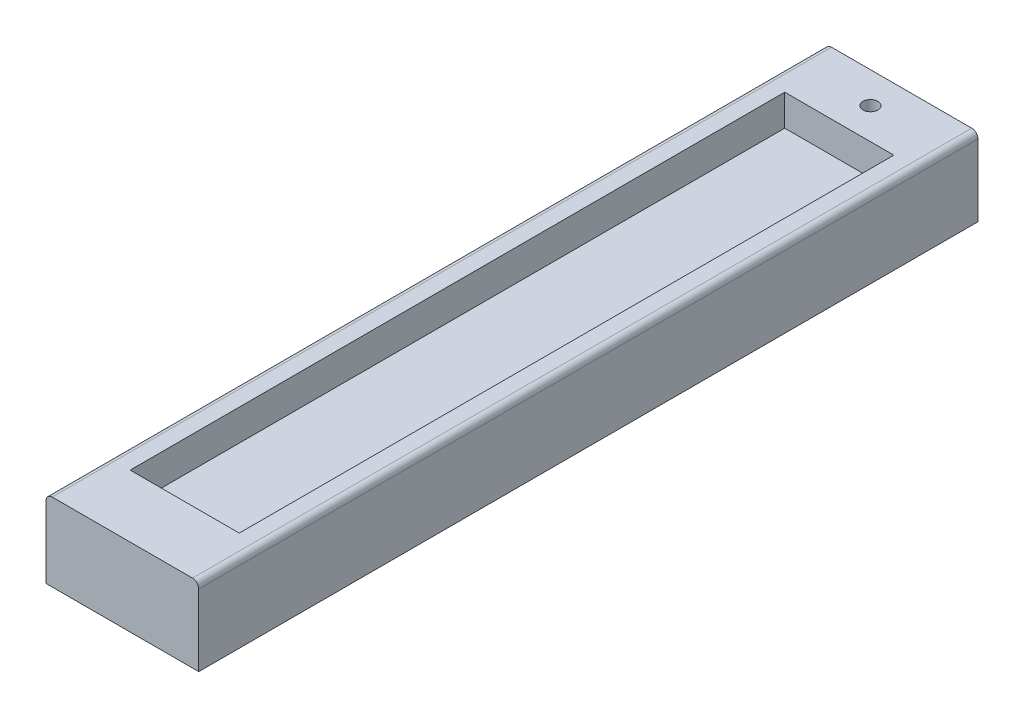
ISO-10303-21;
HEADER;
FILE_DESCRIPTION(('STEP AP214'),'2;1');
FILE_NAME('part.step','',(''),(''),'','','');
FILE_SCHEMA(('AUTOMOTIVE_DESIGN { 1 0 10303 214 1 1 1 1 }'));
ENDSEC;
DATA;
#1=APPLICATION_CONTEXT('core data for automotive mechanical design processes');
#2=APPLICATION_PROTOCOL_DEFINITION('international standard','automotive_design',2000,#1);
#3=PRODUCT_CONTEXT('',#1,'mechanical');
#4=PRODUCT('Part','Part','',(#3));
#5=PRODUCT_RELATED_PRODUCT_CATEGORY('part','',(#4));
#6=PRODUCT_DEFINITION_FORMATION('','',#4);
#7=PRODUCT_DEFINITION_CONTEXT('part definition',#1,'design');
#8=PRODUCT_DEFINITION('design','',#6,#7);
#9=PRODUCT_DEFINITION_SHAPE('','',#8);
#10=(LENGTH_UNIT() NAMED_UNIT(*) SI_UNIT(.MILLI.,.METRE.));
#11=(NAMED_UNIT(*) PLANE_ANGLE_UNIT() SI_UNIT($,.RADIAN.));
#12=(NAMED_UNIT(*) SI_UNIT($,.STERADIAN.) SOLID_ANGLE_UNIT());
#13=UNCERTAINTY_MEASURE_WITH_UNIT(LENGTH_MEASURE(1.E-05),#10,'distance_accuracy_value','');
#14=(GEOMETRIC_REPRESENTATION_CONTEXT(3) GLOBAL_UNCERTAINTY_ASSIGNED_CONTEXT((#13)) GLOBAL_UNIT_ASSIGNED_CONTEXT((#10,
#11,#12)) REPRESENTATION_CONTEXT('',''));
#15=CARTESIAN_POINT('',(0.,0.,0.));
#16=DIRECTION('',(0.,0.,1.));
#17=DIRECTION('',(1.,0.,0.));
#18=AXIS2_PLACEMENT_3D('',#15,#16,#17);
#19=CARTESIAN_POINT('',(-24.5,-10.,125.));
#20=DIRECTION('',(1.,0.,0.));
#21=DIRECTION('',(0.,0.,-1.));
#22=AXIS2_PLACEMENT_3D('',#19,#20,#21);
#23=PLANE('',#22);
#24=DIRECTION('',(0.,-1.,0.));
#25=VECTOR('',#24,1.);
#26=CARTESIAN_POINT('',(-24.5,-10.,125.));
#27=LINE('',#26,#25);
#28=CARTESIAN_POINT('',(-24.5,13.,125.));
#29=VERTEX_POINT('',#28);
#30=CARTESIAN_POINT('',(-24.5,-10.,125.));
#31=VERTEX_POINT('',#30);
#32=EDGE_CURVE('E184',#29,#31,#27,.T.);
#33=ORIENTED_EDGE('',*,*,#32,.F.);
#34=DIRECTION('',(0.,0.,1.));
#35=VECTOR('',#34,1.);
#36=CARTESIAN_POINT('',(-24.5,13.,125.));
#37=LINE('',#36,#35);
#38=CARTESIAN_POINT('',(-24.5,13.,-125.));
#39=VERTEX_POINT('',#38);
#40=EDGE_CURVE('E72',#29,#39,#37,.F.);
#41=ORIENTED_EDGE('',*,*,#40,.T.);
#42=DIRECTION('',(0.,-1.,0.));
#43=VECTOR('',#42,1.);
#44=CARTESIAN_POINT('',(-24.5,-10.,-125.));
#45=LINE('',#44,#43);
#46=CARTESIAN_POINT('',(-24.5,-10.,-125.));
#47=VERTEX_POINT('',#46);
#48=EDGE_CURVE('E183',#39,#47,#45,.T.);
#49=ORIENTED_EDGE('',*,*,#48,.T.);
#50=DIRECTION('',(0.,0.,-1.));
#51=VECTOR('',#50,1.);
#52=CARTESIAN_POINT('',(-24.5,-10.,125.));
#53=LINE('',#52,#51);
#54=EDGE_CURVE('E199',#31,#47,#53,.T.);
#55=ORIENTED_EDGE('',*,*,#54,.F.);
#56=EDGE_LOOP('',(#33,#41,#49,#55));
#57=FACE_BOUND('',#56,.T.);
#58=ADVANCED_FACE('F49',(#57),#23,.F.);
#59=CARTESIAN_POINT('',(24.5,-10.,125.));
#60=DIRECTION('',(0.,1.,0.));
#61=DIRECTION('',(0.,0.,1.));
#62=AXIS2_PLACEMENT_3D('',#59,#60,#61);
#63=PLANE('',#62);
#64=CARTESIAN_POINT('',(-0.5,-10.,110.));
#65=DIRECTION('',(0.,-1.,0.));
#66=DIRECTION('',(0.,0.,-1.));
#67=AXIS2_PLACEMENT_3D('',#64,#65,#66);
#68=CIRCLE('',#67,7.874);
#69=CARTESIAN_POINT('',(-0.5,-10.,102.126));
#70=VERTEX_POINT('',#69);
#71=EDGE_CURVE('E157',#70,#70,#68,.T.);
#72=ORIENTED_EDGE('',*,*,#71,.F.);
#73=EDGE_LOOP('',(#72));
#74=FACE_BOUND('',#73,.T.);
#75=DIRECTION('',(1.,0.,0.));
#76=VECTOR('',#75,1.);
#77=CARTESIAN_POINT('',(24.5,-10.,-125.));
#78=LINE('',#77,#76);
#79=CARTESIAN_POINT('',(24.5,-10.,-125.));
#80=VERTEX_POINT('',#79);
#81=EDGE_CURVE('E194',#47,#80,#78,.T.);
#82=ORIENTED_EDGE('',*,*,#81,.T.);
#83=DIRECTION('',(0.,0.,-1.));
#84=VECTOR('',#83,1.);
#85=CARTESIAN_POINT('',(24.5,-10.,125.));
#86=LINE('',#85,#84);
#87=CARTESIAN_POINT('',(24.5,-10.,125.));
#88=VERTEX_POINT('',#87);
#89=EDGE_CURVE('E192',#88,#80,#86,.T.);
#90=ORIENTED_EDGE('',*,*,#89,.F.);
#91=DIRECTION('',(1.,0.,0.));
#92=VECTOR('',#91,1.);
#93=CARTESIAN_POINT('',(24.5,-10.,125.));
#94=LINE('',#93,#92);
#95=EDGE_CURVE('E186',#31,#88,#94,.T.);
#96=ORIENTED_EDGE('',*,*,#95,.F.);
#97=ORIENTED_EDGE('',*,*,#54,.T.);
#98=EDGE_LOOP('',(#82,#90,#96,#97));
#99=FACE_BOUND('',#98,.T.);
#100=ADVANCED_FACE('F230',(#74,#99),#63,.F.);
#101=CARTESIAN_POINT('',(24.5,-10.,125.));
#102=DIRECTION('',(-1.,0.,0.));
#103=DIRECTION('',(0.,0.,1.));
#104=AXIS2_PLACEMENT_3D('',#101,#102,#103);
#105=PLANE('',#104);
#106=DIRECTION('',(0.,1.,0.));
#107=VECTOR('',#106,1.);
#108=CARTESIAN_POINT('',(24.5,-10.,-125.));
#109=LINE('',#108,#107);
#110=CARTESIAN_POINT('',(24.5,13.,-125.));
#111=VERTEX_POINT('',#110);
#112=EDGE_CURVE('E187',#80,#111,#109,.T.);
#113=ORIENTED_EDGE('',*,*,#112,.T.);
#114=DIRECTION('',(0.,0.,-1.));
#115=VECTOR('',#114,1.);
#116=CARTESIAN_POINT('',(24.5,13.,125.));
#117=LINE('',#116,#115);
#118=CARTESIAN_POINT('',(24.5,13.,125.));
#119=VERTEX_POINT('',#118);
#120=EDGE_CURVE('E11',#111,#119,#117,.F.);
#121=ORIENTED_EDGE('',*,*,#120,.T.);
#122=DIRECTION('',(0.,1.,0.));
#123=VECTOR('',#122,1.);
#124=CARTESIAN_POINT('',(24.5,-10.,125.));
#125=LINE('',#124,#123);
#126=EDGE_CURVE('E189',#88,#119,#125,.T.);
#127=ORIENTED_EDGE('',*,*,#126,.F.);
#128=ORIENTED_EDGE('',*,*,#89,.T.);
#129=EDGE_LOOP('',(#113,#121,#127,#128));
#130=FACE_BOUND('',#129,.T.);
#131=ADVANCED_FACE('F237',(#130),#105,.F.);
#132=CARTESIAN_POINT('',(0.,0.,125.));
#133=DIRECTION('',(0.,0.,1.));
#134=DIRECTION('',(1.,0.,0.));
#135=AXIS2_PLACEMENT_3D('',#132,#133,#134);
#136=PLANE('',#135);
#137=DIRECTION('',(1.,0.,0.));
#138=VECTOR('',#137,1.);
#139=CARTESIAN_POINT('',(24.5,15.,125.));
#140=LINE('',#139,#138);
#141=CARTESIAN_POINT('',(-22.5,15.,125.));
#142=VERTEX_POINT('',#141);
#143=CARTESIAN_POINT('',(22.5,15.,125.));
#144=VERTEX_POINT('',#143);
#145=EDGE_CURVE('E177',#142,#144,#140,.T.);
#146=ORIENTED_EDGE('',*,*,#145,.F.);
#147=CARTESIAN_POINT('',(-22.5,13.,125.));
#148=DIRECTION('',(0.,0.,1.));
#149=DIRECTION('',(1.,0.,0.));
#150=AXIS2_PLACEMENT_3D('',#147,#148,#149);
#151=CIRCLE('',#150,2.);
#152=EDGE_CURVE('E212',#142,#29,#151,.T.);
#153=ORIENTED_EDGE('',*,*,#152,.T.);
#154=ORIENTED_EDGE('',*,*,#32,.T.);
#155=ORIENTED_EDGE('',*,*,#95,.T.);
#156=ORIENTED_EDGE('',*,*,#126,.T.);
#157=CARTESIAN_POINT('',(22.5,13.,125.));
#158=DIRECTION('',(0.,0.,1.));
#159=DIRECTION('',(1.,0.,0.));
#160=AXIS2_PLACEMENT_3D('',#157,#158,#159);
#161=CIRCLE('',#160,2.);
#162=EDGE_CURVE('E210',#119,#144,#161,.T.);
#163=ORIENTED_EDGE('',*,*,#162,.T.);
#164=EDGE_LOOP('',(#146,#153,#154,#155,#156,#163));
#165=FACE_BOUND('',#164,.T.);
#166=ADVANCED_FACE('F226',(#165),#136,.T.);
#167=CARTESIAN_POINT('',(0.,0.,-125.));
#168=DIRECTION('',(0.,0.,1.));
#169=DIRECTION('',(1.,0.,0.));
#170=AXIS2_PLACEMENT_3D('',#167,#168,#169);
#171=PLANE('',#170);
#172=ORIENTED_EDGE('',*,*,#48,.F.);
#173=CARTESIAN_POINT('',(-22.5,13.,-125.));
#174=DIRECTION('',(0.,0.,1.));
#175=DIRECTION('',(1.,0.,0.));
#176=AXIS2_PLACEMENT_3D('',#173,#174,#175);
#177=CIRCLE('',#176,2.);
#178=CARTESIAN_POINT('',(-22.5,15.,-125.));
#179=VERTEX_POINT('',#178);
#180=EDGE_CURVE('E57',#39,#179,#177,.F.);
#181=ORIENTED_EDGE('',*,*,#180,.T.);
#182=DIRECTION('',(-1.,0.,0.));
#183=VECTOR('',#182,1.);
#184=CARTESIAN_POINT('',(24.5,15.,-125.));
#185=LINE('',#184,#183);
#186=CARTESIAN_POINT('',(22.5,15.,-125.));
#187=VERTEX_POINT('',#186);
#188=EDGE_CURVE('E180',#187,#179,#185,.T.);
#189=ORIENTED_EDGE('',*,*,#188,.F.);
#190=CARTESIAN_POINT('',(22.5,13.,-125.));
#191=DIRECTION('',(0.,0.,1.));
#192=DIRECTION('',(1.,0.,0.));
#193=AXIS2_PLACEMENT_3D('',#190,#191,#192);
#194=CIRCLE('',#193,2.);
#195=EDGE_CURVE('E64',#187,#111,#194,.F.);
#196=ORIENTED_EDGE('',*,*,#195,.T.);
#197=ORIENTED_EDGE('',*,*,#112,.F.);
#198=ORIENTED_EDGE('',*,*,#81,.F.);
#199=EDGE_LOOP('',(#172,#181,#189,#196,#197,#198));
#200=FACE_BOUND('',#199,.T.);
#201=ADVANCED_FACE('F216',(#200),#171,.F.);
#202=CARTESIAN_POINT('',(0.,15.,0.));
#203=DIRECTION('',(0.,-1.,0.));
#204=DIRECTION('',(0.,0.,-1.));
#205=AXIS2_PLACEMENT_3D('',#202,#203,#204);
#206=PLANE('',#205);
#207=DIRECTION('',(-1.,0.,0.));
#208=VECTOR('',#207,1.);
#209=CARTESIAN_POINT('',(-17.5,15.,-105.));
#210=LINE('',#209,#208);
#211=CARTESIAN_POINT('',(17.5,15.,-105.));
#212=VERTEX_POINT('',#211);
#213=CARTESIAN_POINT('',(-17.5,15.,-105.));
#214=VERTEX_POINT('',#213);
#215=EDGE_CURVE('E163',#212,#214,#210,.T.);
#216=ORIENTED_EDGE('',*,*,#215,.F.);
#217=DIRECTION('',(0.,0.,-1.));
#218=VECTOR('',#217,1.);
#219=CARTESIAN_POINT('',(17.5,15.,105.));
#220=LINE('',#219,#218);
#221=CARTESIAN_POINT('',(17.5,15.,105.));
#222=VERTEX_POINT('',#221);
#223=EDGE_CURVE('E134',#222,#212,#220,.T.);
#224=ORIENTED_EDGE('',*,*,#223,.F.);
#225=DIRECTION('',(1.,0.,0.));
#226=VECTOR('',#225,1.);
#227=CARTESIAN_POINT('',(-17.5,15.,105.));
#228=LINE('',#227,#226);
#229=CARTESIAN_POINT('',(-17.5,15.,105.));
#230=VERTEX_POINT('',#229);
#231=EDGE_CURVE('E151',#230,#222,#228,.T.);
#232=ORIENTED_EDGE('',*,*,#231,.F.);
#233=DIRECTION('',(0.,0.,1.));
#234=VECTOR('',#233,1.);
#235=CARTESIAN_POINT('',(-17.5,15.,105.));
#236=LINE('',#235,#234);
#237=EDGE_CURVE('E154',#214,#230,#236,.T.);
#238=ORIENTED_EDGE('',*,*,#237,.F.);
#239=EDGE_LOOP('',(#216,#224,#232,#238));
#240=FACE_BOUND('',#239,.T.);
#241=CARTESIAN_POINT('',(0.,15.,-115.));
#242=DIRECTION('',(0.,-1.,0.));
#243=DIRECTION('',(0.,0.,-1.));
#244=AXIS2_PLACEMENT_3D('',#241,#242,#243);
#245=CIRCLE('',#244,2.4);
#246=CARTESIAN_POINT('',(0.,15.,-117.4));
#247=VERTEX_POINT('',#246);
#248=EDGE_CURVE('E176',#247,#247,#245,.F.);
#249=ORIENTED_EDGE('',*,*,#248,.F.);
#250=EDGE_LOOP('',(#249));
#251=FACE_BOUND('',#250,.T.);
#252=ORIENTED_EDGE('',*,*,#188,.T.);
#253=DIRECTION('',(0.,0.,1.));
#254=VECTOR('',#253,1.);
#255=CARTESIAN_POINT('',(-22.5,15.,0.));
#256=LINE('',#255,#254);
#257=EDGE_CURVE('E207',#179,#142,#256,.T.);
#258=ORIENTED_EDGE('',*,*,#257,.T.);
#259=ORIENTED_EDGE('',*,*,#145,.T.);
#260=DIRECTION('',(0.,0.,-1.));
#261=VECTOR('',#260,1.);
#262=CARTESIAN_POINT('',(22.5,15.,0.));
#263=LINE('',#262,#261);
#264=EDGE_CURVE('E202',#144,#187,#263,.T.);
#265=ORIENTED_EDGE('',*,*,#264,.T.);
#266=EDGE_LOOP('',(#252,#258,#259,#265));
#267=FACE_BOUND('',#266,.T.);
#268=ADVANCED_FACE('F221',(#240,#251,#267),#206,.F.);
#269=CARTESIAN_POINT('',(0.,15.000012,-115.));
#270=DIRECTION('',(0.,-1.,0.));
#271=DIRECTION('',(0.,0.,-1.));
#272=AXIS2_PLACEMENT_3D('',#269,#270,#271);
#273=CYLINDRICAL_SURFACE('',#272,2.4);
#274=CARTESIAN_POINT('',(0.,5.,-115.));
#275=DIRECTION('',(0.,1.,0.));
#276=DIRECTION('',(0.,0.,1.));
#277=AXIS2_PLACEMENT_3D('',#274,#275,#276);
#278=CIRCLE('',#277,2.4);
#279=CARTESIAN_POINT('',(0.,5.,-117.4));
#280=VERTEX_POINT('',#279);
#281=EDGE_CURVE('E170',#280,#280,#278,.T.);
#282=CARTESIAN_POINT('',(0.,5.,-117.4));
#283=CARTESIAN_POINT('',(0.,5.10416666666667,-117.4));
#284=CARTESIAN_POINT('',(0.,5.20833333333333,-117.4));
#285=CARTESIAN_POINT('',(0.,5.41666666666667,-117.4));
#286=CARTESIAN_POINT('',(0.,5.52083333333333,-117.4));
#287=CARTESIAN_POINT('',(0.,5.72916666666667,-117.4));
#288=CARTESIAN_POINT('',(0.,5.83333333333333,-117.4));
#289=CARTESIAN_POINT('',(0.,6.04166666666667,-117.4));
#290=CARTESIAN_POINT('',(0.,6.14583333333333,-117.4));
#291=CARTESIAN_POINT('',(0.,6.35416666666667,-117.4));
#292=CARTESIAN_POINT('',(0.,6.45833333333333,-117.4));
#293=CARTESIAN_POINT('',(0.,6.66666666666667,-117.4));
#294=CARTESIAN_POINT('',(0.,6.77083333333333,-117.4));
#295=CARTESIAN_POINT('',(0.,6.97916666666667,-117.4));
#296=CARTESIAN_POINT('',(0.,7.08333333333333,-117.4));
#297=CARTESIAN_POINT('',(0.,7.29166666666667,-117.4));
#298=CARTESIAN_POINT('',(0.,7.39583333333333,-117.4));
#299=CARTESIAN_POINT('',(0.,7.60416666666667,-117.4));
#300=CARTESIAN_POINT('',(0.,7.70833333333333,-117.4));
#301=CARTESIAN_POINT('',(0.,7.91666666666667,-117.4));
#302=CARTESIAN_POINT('',(0.,8.02083333333333,-117.4));
#303=CARTESIAN_POINT('',(0.,8.22916666666667,-117.4));
#304=CARTESIAN_POINT('',(0.,8.33333333333333,-117.4));
#305=CARTESIAN_POINT('',(0.,8.54166666666667,-117.4));
#306=CARTESIAN_POINT('',(0.,8.64583333333333,-117.4));
#307=CARTESIAN_POINT('',(0.,8.85416666666667,-117.4));
#308=CARTESIAN_POINT('',(0.,8.95833333333333,-117.4));
#309=CARTESIAN_POINT('',(0.,9.16666666666666,-117.4));
#310=CARTESIAN_POINT('',(0.,9.27083333333333,-117.4));
#311=CARTESIAN_POINT('',(0.,9.47916666666667,-117.4));
#312=CARTESIAN_POINT('',(0.,9.58333333333333,-117.4));
#313=CARTESIAN_POINT('',(0.,9.79166666666667,-117.4));
#314=CARTESIAN_POINT('',(0.,9.89583333333333,-117.4));
#315=CARTESIAN_POINT('',(0.,10.1041666666667,-117.4));
#316=CARTESIAN_POINT('',(0.,10.2083333333333,-117.4));
#317=CARTESIAN_POINT('',(0.,10.4166666666667,-117.4));
#318=CARTESIAN_POINT('',(0.,10.5208333333333,-117.4));
#319=CARTESIAN_POINT('',(0.,10.7291666666667,-117.4));
#320=CARTESIAN_POINT('',(0.,10.8333333333333,-117.4));
#321=CARTESIAN_POINT('',(0.,11.0416666666667,-117.4));
#322=CARTESIAN_POINT('',(0.,11.1458333333333,-117.4));
#323=CARTESIAN_POINT('',(0.,11.3541666666667,-117.4));
#324=CARTESIAN_POINT('',(0.,11.4583333333333,-117.4));
#325=CARTESIAN_POINT('',(0.,11.6666666666667,-117.4));
#326=CARTESIAN_POINT('',(0.,11.7708333333333,-117.4));
#327=CARTESIAN_POINT('',(0.,11.9791666666667,-117.4));
#328=CARTESIAN_POINT('',(0.,12.0833333333333,-117.4));
#329=CARTESIAN_POINT('',(0.,12.2916666666667,-117.4));
#330=CARTESIAN_POINT('',(0.,12.3958333333333,-117.4));
#331=CARTESIAN_POINT('',(0.,12.6041666666667,-117.4));
#332=CARTESIAN_POINT('',(0.,12.7083333333333,-117.4));
#333=CARTESIAN_POINT('',(0.,12.9166666666667,-117.4));
#334=CARTESIAN_POINT('',(0.,13.0208333333333,-117.4));
#335=CARTESIAN_POINT('',(0.,13.2291666666667,-117.4));
#336=CARTESIAN_POINT('',(0.,13.3333333333333,-117.4));
#337=CARTESIAN_POINT('',(0.,13.5416666666667,-117.4));
#338=CARTESIAN_POINT('',(0.,13.6458333333333,-117.4));
#339=CARTESIAN_POINT('',(0.,13.8541666666667,-117.4));
#340=CARTESIAN_POINT('',(0.,13.9583333333333,-117.4));
#341=CARTESIAN_POINT('',(0.,14.1666666666667,-117.4));
#342=CARTESIAN_POINT('',(0.,14.2708333333333,-117.4));
#343=CARTESIAN_POINT('',(0.,14.4791666666667,-117.4));
#344=CARTESIAN_POINT('',(0.,14.5833333333333,-117.4));
#345=CARTESIAN_POINT('',(0.,14.7916666666667,-117.4));
#346=CARTESIAN_POINT('',(0.,14.8958333333333,-117.4));
#347=CARTESIAN_POINT('',(0.,15.,-117.4));
#348=B_SPLINE_CURVE_WITH_KNOTS('',3,(#282,#283,#284,#285,#286,#287,#288,#289,#290,#291,#292,
#293,#294,#295,#296,#297,#298,#299,#300,#301,#302,#303,#304,#305,#306,#307,#308,#309,#310,#311,
#312,#313,#314,#315,#316,#317,#318,#319,#320,#321,#322,#323,#324,#325,#326,#327,#328,#329,#330,
#331,#332,#333,#334,#335,#336,#337,#338,#339,#340,#341,#342,#343,#344,#345,#346,#347),
.UNSPECIFIED.,.F.,.F.,(4,2,2,2,2,2,2,2,2,2,2,2,2,2,2,2,2,2,2,2,2,2,2,2,2,2,2,2,2,2,2,2,4),(0.,
0.3125,0.625000000000001,0.937500000000001,1.25,1.5625,1.875,2.1875,2.5,2.8125,3.125,3.4375,
3.75,4.0625,4.375,4.6875,5.,5.3125,5.625,5.9375,6.25,6.5625,6.875,7.1875,7.5,7.8125,8.125,
8.4375,8.75,9.0625,9.375,9.6875,10.),.UNSPECIFIED.);
#349=EDGE_CURVE('BSEAM280',#280,#247,#348,.T.);
#350=ORIENTED_EDGE('',*,*,#281,.F.);
#351=ORIENTED_EDGE('',*,*,#248,.T.);
#352=ORIENTED_EDGE('',*,*,#349,.T.);
#353=ORIENTED_EDGE('',*,*,#349,.F.);
#354=EDGE_LOOP('',(#350,#352,#351,#353));
#355=FACE_BOUND('',#354,.T.);
#356=ADVANCED_FACE('F280',(#355),#273,.F.);
#357=CARTESIAN_POINT('',(0.,5.,-115.));
#358=DIRECTION('',(0.,1.,0.));
#359=DIRECTION('',(0.,0.,1.));
#360=AXIS2_PLACEMENT_3D('',#357,#358,#359);
#361=PLANE('',#360);
#362=ORIENTED_EDGE('',*,*,#281,.T.);
#363=EDGE_LOOP('',(#362));
#364=FACE_BOUND('',#363,.T.);
#365=ADVANCED_FACE('F277',(#364),#361,.T.);
#366=CARTESIAN_POINT('',(17.5,5.,105.));
#367=DIRECTION('',(1.,0.,0.));
#368=DIRECTION('',(0.,0.,-1.));
#369=AXIS2_PLACEMENT_3D('',#366,#367,#368);
#370=PLANE('',#369);
#371=ORIENTED_EDGE('',*,*,#223,.T.);
#372=DIRECTION('',(0.,1.,0.));
#373=VECTOR('',#372,1.);
#374=CARTESIAN_POINT('',(17.5,5.,-105.));
#375=LINE('',#374,#373);
#376=CARTESIAN_POINT('',(17.5,5.,-105.));
#377=VERTEX_POINT('',#376);
#378=EDGE_CURVE('E127',#377,#212,#375,.T.);
#379=ORIENTED_EDGE('',*,*,#378,.F.);
#380=DIRECTION('',(0.,0.,-1.));
#381=VECTOR('',#380,1.);
#382=CARTESIAN_POINT('',(17.5,5.,105.));
#383=LINE('',#382,#381);
#384=CARTESIAN_POINT('',(17.5,5.,105.));
#385=VERTEX_POINT('',#384);
#386=EDGE_CURVE('E131',#385,#377,#383,.T.);
#387=ORIENTED_EDGE('',*,*,#386,.F.);
#388=DIRECTION('',(0.,1.,0.));
#389=VECTOR('',#388,1.);
#390=CARTESIAN_POINT('',(17.5,5.,105.));
#391=LINE('',#390,#389);
#392=EDGE_CURVE('E168',#385,#222,#391,.T.);
#393=ORIENTED_EDGE('',*,*,#392,.T.);
#394=EDGE_LOOP('',(#371,#379,#387,#393));
#395=FACE_BOUND('',#394,.T.);
#396=ADVANCED_FACE('F129',(#395),#370,.F.);
#397=CARTESIAN_POINT('',(-17.5,5.,105.));
#398=DIRECTION('',(0.,0.,1.));
#399=DIRECTION('',(1.,0.,0.));
#400=AXIS2_PLACEMENT_3D('',#397,#398,#399);
#401=PLANE('',#400);
#402=ORIENTED_EDGE('',*,*,#231,.T.);
#403=ORIENTED_EDGE('',*,*,#392,.F.);
#404=DIRECTION('',(1.,0.,0.));
#405=VECTOR('',#404,1.);
#406=CARTESIAN_POINT('',(-17.5,5.,105.));
#407=LINE('',#406,#405);
#408=CARTESIAN_POINT('',(-17.5,5.,105.));
#409=VERTEX_POINT('',#408);
#410=EDGE_CURVE('E139',#409,#385,#407,.T.);
#411=ORIENTED_EDGE('',*,*,#410,.F.);
#412=DIRECTION('',(0.,1.,0.));
#413=VECTOR('',#412,1.);
#414=CARTESIAN_POINT('',(-17.5,5.,105.));
#415=LINE('',#414,#413);
#416=EDGE_CURVE('E171',#409,#230,#415,.T.);
#417=ORIENTED_EDGE('',*,*,#416,.T.);
#418=EDGE_LOOP('',(#402,#403,#411,#417));
#419=FACE_BOUND('',#418,.T.);
#420=ADVANCED_FACE('F268',(#419),#401,.F.);
#421=CARTESIAN_POINT('',(-17.5,5.,105.));
#422=DIRECTION('',(-1.,0.,0.));
#423=DIRECTION('',(0.,0.,1.));
#424=AXIS2_PLACEMENT_3D('',#421,#422,#423);
#425=PLANE('',#424);
#426=ORIENTED_EDGE('',*,*,#237,.T.);
#427=ORIENTED_EDGE('',*,*,#416,.F.);
#428=DIRECTION('',(0.,0.,1.));
#429=VECTOR('',#428,1.);
#430=CARTESIAN_POINT('',(-17.5,5.,105.));
#431=LINE('',#430,#429);
#432=CARTESIAN_POINT('',(-17.5,5.,-105.));
#433=VERTEX_POINT('',#432);
#434=EDGE_CURVE('E147',#433,#409,#431,.T.);
#435=ORIENTED_EDGE('',*,*,#434,.F.);
#436=DIRECTION('',(0.,1.,0.));
#437=VECTOR('',#436,1.);
#438=CARTESIAN_POINT('',(-17.5,5.,-105.));
#439=LINE('',#438,#437);
#440=EDGE_CURVE('E138',#433,#214,#439,.T.);
#441=ORIENTED_EDGE('',*,*,#440,.T.);
#442=EDGE_LOOP('',(#426,#427,#435,#441));
#443=FACE_BOUND('',#442,.T.);
#444=ADVANCED_FACE('F263',(#443),#425,.F.);
#445=CARTESIAN_POINT('',(-17.5,5.,-105.));
#446=DIRECTION('',(0.,0.,-1.));
#447=DIRECTION('',(-1.,0.,0.));
#448=AXIS2_PLACEMENT_3D('',#445,#446,#447);
#449=PLANE('',#448);
#450=ORIENTED_EDGE('',*,*,#215,.T.);
#451=ORIENTED_EDGE('',*,*,#440,.F.);
#452=DIRECTION('',(-1.,0.,0.));
#453=VECTOR('',#452,1.);
#454=CARTESIAN_POINT('',(-17.5,5.,-105.));
#455=LINE('',#454,#453);
#456=EDGE_CURVE('E142',#377,#433,#455,.T.);
#457=ORIENTED_EDGE('',*,*,#456,.F.);
#458=ORIENTED_EDGE('',*,*,#378,.T.);
#459=EDGE_LOOP('',(#450,#451,#457,#458));
#460=FACE_BOUND('',#459,.T.);
#461=ADVANCED_FACE('F143',(#460),#449,.F.);
#462=CARTESIAN_POINT('',(0.,5.,0.));
#463=DIRECTION('',(0.,-1.,0.));
#464=DIRECTION('',(0.,0.,-1.));
#465=AXIS2_PLACEMENT_3D('',#462,#463,#464);
#466=PLANE('',#465);
#467=ORIENTED_EDGE('',*,*,#386,.T.);
#468=ORIENTED_EDGE('',*,*,#456,.T.);
#469=ORIENTED_EDGE('',*,*,#434,.T.);
#470=ORIENTED_EDGE('',*,*,#410,.T.);
#471=EDGE_LOOP('',(#467,#468,#469,#470));
#472=FACE_BOUND('',#471,.T.);
#473=ADVANCED_FACE('F149',(#472),#466,.F.);
#474=CARTESIAN_POINT('',(-22.5,13.,0.));
#475=DIRECTION('',(0.,0.,1.));
#476=DIRECTION('',(1.,0.,0.));
#477=AXIS2_PLACEMENT_3D('',#474,#475,#476);
#478=CYLINDRICAL_SURFACE('',#477,2.);
#479=ORIENTED_EDGE('',*,*,#180,.F.);
#480=ORIENTED_EDGE('',*,*,#40,.F.);
#481=ORIENTED_EDGE('',*,*,#152,.F.);
#482=ORIENTED_EDGE('',*,*,#257,.F.);
#483=EDGE_LOOP('',(#479,#480,#481,#482));
#484=FACE_BOUND('',#483,.T.);
#485=ADVANCED_FACE('F224',(#484),#478,.T.);
#486=CARTESIAN_POINT('',(22.5,13.,0.));
#487=DIRECTION('',(0.,0.,-1.));
#488=DIRECTION('',(-1.,0.,0.));
#489=AXIS2_PLACEMENT_3D('',#486,#487,#488);
#490=CYLINDRICAL_SURFACE('',#489,2.);
#491=ORIENTED_EDGE('',*,*,#162,.F.);
#492=ORIENTED_EDGE('',*,*,#120,.F.);
#493=ORIENTED_EDGE('',*,*,#195,.F.);
#494=ORIENTED_EDGE('',*,*,#264,.F.);
#495=EDGE_LOOP('',(#491,#492,#493,#494));
#496=FACE_BOUND('',#495,.T.);
#497=ADVANCED_FACE('F51',(#496),#490,.T.);
#498=CARTESIAN_POINT('',(-0.5,0.,110.));
#499=DIRECTION('',(0.,-1.,0.));
#500=DIRECTION('',(0.,0.,-1.));
#501=AXIS2_PLACEMENT_3D('',#498,#499,#500);
#502=CYLINDRICAL_SURFACE('',#501,7.874);
#503=CARTESIAN_POINT('',(-0.5,0.,110.));
#504=DIRECTION('',(0.,-1.,0.));
#505=DIRECTION('',(0.,0.,-1.));
#506=AXIS2_PLACEMENT_3D('',#503,#504,#505);
#507=CIRCLE('',#506,7.874);
#508=CARTESIAN_POINT('',(-0.5,0.,102.126));
#509=VERTEX_POINT('',#508);
#510=EDGE_CURVE('E164',#509,#509,#507,.T.);
#511=ORIENTED_EDGE('',*,*,#510,.F.);
#512=EDGE_LOOP('',(#511));
#513=FACE_BOUND('',#512,.T.);
#514=ORIENTED_EDGE('',*,*,#71,.T.);
#515=EDGE_LOOP('',(#514));
#516=FACE_BOUND('',#515,.T.);
#517=ADVANCED_FACE('F258',(#513,#516),#502,.F.);
#518=CARTESIAN_POINT('',(-0.5,0.,110.));
#519=DIRECTION('',(0.,-1.,0.));
#520=DIRECTION('',(0.,0.,-1.));
#521=AXIS2_PLACEMENT_3D('',#518,#519,#520);
#522=PLANE('',#521);
#523=ORIENTED_EDGE('',*,*,#510,.T.);
#524=EDGE_LOOP('',(#523));
#525=FACE_BOUND('',#524,.T.);
#526=ADVANCED_FACE('F327',(#525),#522,.T.);
#527=CLOSED_SHELL('',(#58,#100,#131,#166,#201,#268,#356,#365,#396,#420,#444,#461,#473,#485,#497,
#517,#526));
#528=MANIFOLD_SOLID_BREP('B2',#527);
#529=ADVANCED_BREP_SHAPE_REPRESENTATION('',(#18,#528),#14);
#530=SHAPE_DEFINITION_REPRESENTATION(#9,#529);
ENDSEC;
END-ISO-10303-21;
